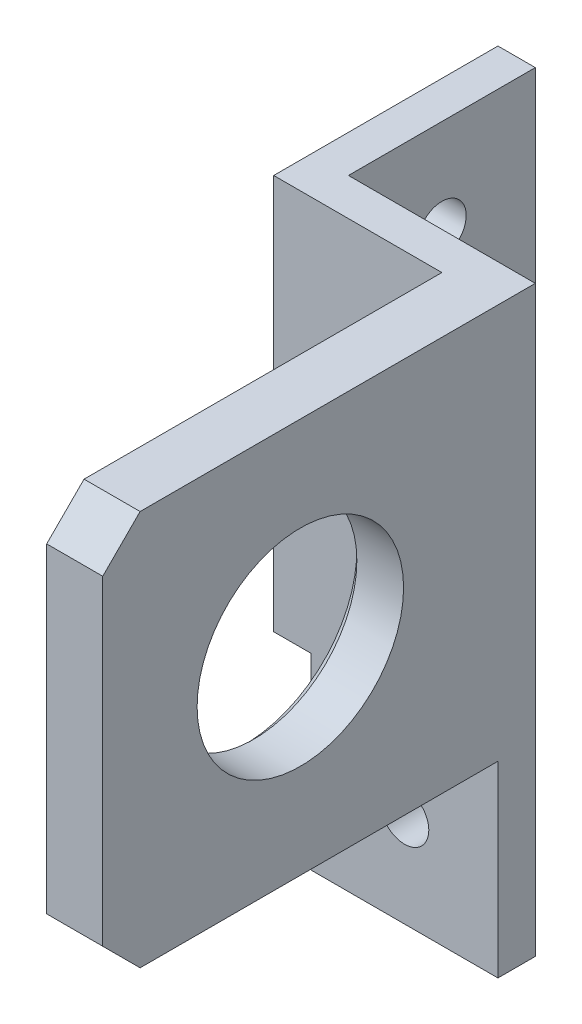
ISO-10303-21;
HEADER;
FILE_DESCRIPTION(('STEP AP214'),'2;1');
FILE_NAME('part.step','',(''),(''),'','','');
FILE_SCHEMA(('AUTOMOTIVE_DESIGN { 1 0 10303 214 1 1 1 1 }'));
ENDSEC;
DATA;
#1=APPLICATION_CONTEXT('core data for automotive mechanical design processes');
#2=APPLICATION_PROTOCOL_DEFINITION('international standard','automotive_design',2000,#1);
#3=PRODUCT_CONTEXT('',#1,'mechanical');
#4=PRODUCT('Part','Part','',(#3));
#5=PRODUCT_RELATED_PRODUCT_CATEGORY('part','',(#4));
#6=PRODUCT_DEFINITION_FORMATION('','',#4);
#7=PRODUCT_DEFINITION_CONTEXT('part definition',#1,'design');
#8=PRODUCT_DEFINITION('design','',#6,#7);
#9=PRODUCT_DEFINITION_SHAPE('','',#8);
#10=(LENGTH_UNIT() NAMED_UNIT(*) SI_UNIT(.MILLI.,.METRE.));
#11=(NAMED_UNIT(*) PLANE_ANGLE_UNIT() SI_UNIT($,.RADIAN.));
#12=(NAMED_UNIT(*) SI_UNIT($,.STERADIAN.) SOLID_ANGLE_UNIT());
#13=UNCERTAINTY_MEASURE_WITH_UNIT(LENGTH_MEASURE(1.E-05),#10,'distance_accuracy_value','');
#14=(GEOMETRIC_REPRESENTATION_CONTEXT(3) GLOBAL_UNCERTAINTY_ASSIGNED_CONTEXT((#13)) GLOBAL_UNIT_ASSIGNED_CONTEXT((#10,
#11,#12)) REPRESENTATION_CONTEXT('',''));
#15=CARTESIAN_POINT('',(0.,0.,0.));
#16=DIRECTION('',(0.,0.,1.));
#17=DIRECTION('',(1.,0.,0.));
#18=AXIS2_PLACEMENT_3D('',#15,#16,#17);
#19=CARTESIAN_POINT('',(-4.52428779759901,-82.2999999999999,4.));
#20=DIRECTION('',(0.,1.,0.));
#21=DIRECTION('',(-1.,0.,0.));
#22=AXIS2_PLACEMENT_3D('',#19,#20,#21);
#23=PLANE('',#22);
#24=DIRECTION('',(0.,0.,-1.));
#25=VECTOR('',#24,1.);
#26=CARTESIAN_POINT('',(-24.5242877975988,-82.2999999999999,0.));
#27=LINE('',#26,#25);
#28=CARTESIAN_POINT('',(-24.5242877975988,-82.2999999999999,4.00000000000001));
#29=VERTEX_POINT('',#28);
#30=CARTESIAN_POINT('',(-24.5242877975988,-82.2999999999999,0.));
#31=VERTEX_POINT('',#30);
#32=EDGE_CURVE('E236',#29,#31,#27,.T.);
#33=ORIENTED_EDGE('',*,*,#32,.F.);
#34=DIRECTION('',(1.,0.,0.));
#35=VECTOR('',#34,1.);
#36=CARTESIAN_POINT('',(-4.52428779759901,-82.2999999999999,4.));
#37=LINE('',#36,#35);
#38=CARTESIAN_POINT('',(-28.5242877975988,-82.2999999999999,4.00000000000001));
#39=VERTEX_POINT('',#38);
#40=EDGE_CURVE('E183',#39,#29,#37,.T.);
#41=ORIENTED_EDGE('',*,*,#40,.F.);
#42=DIRECTION('',(0.,0.,1.));
#43=VECTOR('',#42,1.);
#44=CARTESIAN_POINT('',(-28.5242877975988,-82.2999999999999,4.00000000000001));
#45=LINE('',#44,#43);
#46=CARTESIAN_POINT('',(-28.5242877975988,-82.2999999999999,-20.0000000000001));
#47=VERTEX_POINT('',#46);
#48=EDGE_CURVE('E165',#47,#39,#45,.T.);
#49=ORIENTED_EDGE('',*,*,#48,.F.);
#50=DIRECTION('',(1.,0.,0.));
#51=VECTOR('',#50,1.);
#52=CARTESIAN_POINT('',(-28.5242877975988,-82.2999999999999,-20.0000000000001));
#53=LINE('',#52,#51);
#54=CARTESIAN_POINT('',(-24.5242877975988,-82.2999999999999,-20.0000000000001));
#55=VERTEX_POINT('',#54);
#56=EDGE_CURVE('E168',#47,#55,#53,.T.);
#57=ORIENTED_EDGE('',*,*,#56,.T.);
#58=DIRECTION('',(0.,0.,1.));
#59=VECTOR('',#58,1.);
#60=CARTESIAN_POINT('',(-24.5242877975988,-82.2999999999999,4.00000000000001));
#61=LINE('',#60,#59);
#62=EDGE_CURVE('E161',#55,#31,#61,.T.);
#63=ORIENTED_EDGE('',*,*,#62,.T.);
#64=EDGE_LOOP('',(#33,#41,#49,#57,#63));
#65=FACE_BOUND('',#64,.T.);
#66=ADVANCED_FACE('F34',(#65),#23,.F.);
#67=DIRECTION('',(0.,0.,-1.));
#68=VECTOR('',#67,1.);
#69=CARTESIAN_POINT('',(-4.52428779759901,-82.2999999999999,4.));
#70=LINE('',#69,#68);
#71=CARTESIAN_POINT('',(-4.52428779759902,-82.2999999999999,42.3000000000002));
#72=VERTEX_POINT('',#71);
#73=CARTESIAN_POINT('',(-4.52428779759901,-82.2999999999999,4.));
#74=VERTEX_POINT('',#73);
#75=EDGE_CURVE('E187',#72,#74,#70,.T.);
#76=ORIENTED_EDGE('',*,*,#75,.F.);
#77=DIRECTION('',(-1.,0.,0.));
#78=VECTOR('',#77,1.);
#79=CARTESIAN_POINT('',(69.475712202401,-82.2999999999999,42.3000000000002));
#80=LINE('',#79,#78);
#81=CARTESIAN_POINT('',(-10.524287797599,-82.2999999999999,42.3000000000002));
#82=VERTEX_POINT('',#81);
#83=EDGE_CURVE('E140',#72,#82,#80,.T.);
#84=ORIENTED_EDGE('',*,*,#83,.T.);
#85=DIRECTION('',(0.,0.,-1.));
#86=VECTOR('',#85,1.);
#87=CARTESIAN_POINT('',(-10.524287797599,-82.2999999999999,89.0234127850291));
#88=LINE('',#87,#86);
#89=CARTESIAN_POINT('',(-10.524287797599,-82.2999999999999,4.));
#90=VERTEX_POINT('',#89);
#91=EDGE_CURVE('E149',#82,#90,#88,.T.);
#92=ORIENTED_EDGE('',*,*,#91,.T.);
#93=DIRECTION('',(-1.,0.,0.));
#94=VECTOR('',#93,1.);
#95=CARTESIAN_POINT('',(-4.52428779759901,-82.2999999999999,4.));
#96=LINE('',#95,#94);
#97=EDGE_CURVE('E239',#74,#90,#96,.T.);
#98=ORIENTED_EDGE('',*,*,#97,.F.);
#99=EDGE_LOOP('',(#76,#84,#92,#98));
#100=FACE_BOUND('',#99,.T.);
#101=ADVANCED_FACE('F259',(#100),#23,.F.);
#102=CARTESIAN_POINT('',(0.,0.,4.));
#103=DIRECTION('',(0.,0.,-1.));
#104=DIRECTION('',(-1.,0.,0.));
#105=AXIS2_PLACEMENT_3D('',#102,#103,#104);
#106=PLANE('',#105);
#107=CARTESIAN_POINT('',(-14.524287797599,-92.3915967434677,4.));
#108=DIRECTION('',(0.,0.,1.));
#109=DIRECTION('',(1.,0.,0.));
#110=AXIS2_PLACEMENT_3D('',#107,#108,#109);
#111=CIRCLE('',#110,2.6);
#112=CARTESIAN_POINT('',(-11.924287797599,-92.3915967434677,4.));
#113=VERTEX_POINT('',#112);
#114=EDGE_CURVE('E250',#113,#113,#111,.T.);
#115=ORIENTED_EDGE('',*,*,#114,.F.);
#116=EDGE_LOOP('',(#115));
#117=FACE_BOUND('',#116,.T.);
#118=DIRECTION('',(0.,-1.,0.));
#119=VECTOR('',#118,1.);
#120=CARTESIAN_POINT('',(-10.524287797599,-40.,4.));
#121=LINE('',#120,#119);
#122=CARTESIAN_POINT('',(-10.524287797599,-40.,4.));
#123=VERTEX_POINT('',#122);
#124=EDGE_CURVE('E146',#123,#90,#121,.T.);
#125=ORIENTED_EDGE('',*,*,#124,.F.);
#126=DIRECTION('',(-1.,0.,0.));
#127=VECTOR('',#126,1.);
#128=CARTESIAN_POINT('',(-4.52428779759901,-40.,4.));
#129=LINE('',#128,#127);
#130=CARTESIAN_POINT('',(-28.5242877975987,-40.,4.));
#131=VERTEX_POINT('',#130);
#132=EDGE_CURVE('E145',#123,#131,#129,.T.);
#133=ORIENTED_EDGE('',*,*,#132,.T.);
#134=DIRECTION('',(0.,1.,0.));
#135=VECTOR('',#134,1.);
#136=CARTESIAN_POINT('',(-28.5242877975987,-40.,4.));
#137=LINE('',#136,#135);
#138=EDGE_CURVE('E157',#39,#131,#137,.T.);
#139=ORIENTED_EDGE('',*,*,#138,.F.);
#140=ORIENTED_EDGE('',*,*,#40,.T.);
#141=DIRECTION('',(0.,1.,0.));
#142=VECTOR('',#141,1.);
#143=CARTESIAN_POINT('',(-24.5242877975989,-122.787674797839,4.00000000000001));
#144=LINE('',#143,#142);
#145=CARTESIAN_POINT('',(-24.5242877975988,-102.391596743468,4.00000000000001));
#146=VERTEX_POINT('',#145);
#147=EDGE_CURVE('E232',#146,#29,#144,.T.);
#148=ORIENTED_EDGE('',*,*,#147,.F.);
#149=DIRECTION('',(1.,0.,0.));
#150=VECTOR('',#149,1.);
#151=CARTESIAN_POINT('',(-4.52428779759903,-102.391596743468,4.));
#152=LINE('',#151,#150);
#153=CARTESIAN_POINT('',(-4.52428779759901,-102.391596743468,4.));
#154=VERTEX_POINT('',#153);
#155=EDGE_CURVE('E245',#146,#154,#152,.T.);
#156=ORIENTED_EDGE('',*,*,#155,.T.);
#157=DIRECTION('',(0.,1.,0.));
#158=VECTOR('',#157,1.);
#159=CARTESIAN_POINT('',(-4.52428779759904,-122.787674797839,4.));
#160=LINE('',#159,#158);
#161=EDGE_CURVE('E229',#154,#74,#160,.T.);
#162=ORIENTED_EDGE('',*,*,#161,.T.);
#163=ORIENTED_EDGE('',*,*,#97,.T.);
#164=EDGE_LOOP('',(#125,#133,#139,#140,#148,#156,#162,#163));
#165=FACE_BOUND('',#164,.T.);
#166=ADVANCED_FACE('F285',(#117,#165),#106,.F.);
#167=CARTESIAN_POINT('',(-4.52428779759901,-40.,4.));
#168=DIRECTION('',(-1.,0.,0.));
#169=DIRECTION('',(0.,-1.,0.));
#170=AXIS2_PLACEMENT_3D('',#167,#168,#169);
#171=PLANE('',#170);
#172=CARTESIAN_POINT('',(-4.52428779759902,-61.1499999999999,25.1499999999999));
#173=DIRECTION('',(1.,0.,0.));
#174=DIRECTION('',(0.,0.,-1.));
#175=AXIS2_PLACEMENT_3D('',#172,#173,#174);
#176=CIRCLE('',#175,11.05);
#177=CARTESIAN_POINT('',(-4.52428779759902,-61.1499999999999,14.0999999999999));
#178=VERTEX_POINT('',#177);
#179=EDGE_CURVE('E147',#178,#178,#176,.T.);
#180=ORIENTED_EDGE('',*,*,#179,.F.);
#181=EDGE_LOOP('',(#180));
#182=FACE_BOUND('',#181,.T.);
#183=DIRECTION('',(0.,0.,-1.));
#184=VECTOR('',#183,1.);
#185=CARTESIAN_POINT('',(-4.52428779759901,-40.,4.));
#186=LINE('',#185,#184);
#187=CARTESIAN_POINT('',(-4.52428779759902,-40.,42.3000000000001));
#188=VERTEX_POINT('',#187);
#189=CARTESIAN_POINT('',(-4.52428779759901,-40.,0.));
#190=VERTEX_POINT('',#189);
#191=EDGE_CURVE('E195',#188,#190,#186,.T.);
#192=ORIENTED_EDGE('',*,*,#191,.F.);
#193=DIRECTION('',(0.,-0.707106781186549,0.707106781186546));
#194=VECTOR('',#193,1.);
#195=CARTESIAN_POINT('',(-4.52428779759902,-20.8499999999999,23.1500000000001));
#196=LINE('',#195,#194);
#197=CARTESIAN_POINT('',(-4.524287797599,-43.9999999999998,46.3));
#198=VERTEX_POINT('',#197);
#199=EDGE_CURVE('E126',#188,#198,#196,.T.);
#200=ORIENTED_EDGE('',*,*,#199,.T.);
#201=DIRECTION('',(0.,1.,0.));
#202=VECTOR('',#201,1.);
#203=CARTESIAN_POINT('',(-4.52428779759901,-40.,46.3));
#204=LINE('',#203,#202);
#205=CARTESIAN_POINT('',(-4.52428779759901,-78.3000000000002,46.3));
#206=VERTEX_POINT('',#205);
#207=EDGE_CURVE('E172',#206,#198,#204,.T.);
#208=ORIENTED_EDGE('',*,*,#207,.F.);
#209=DIRECTION('',(0.,-0.707106781186546,-0.707106781186549));
#210=VECTOR('',#209,1.);
#211=CARTESIAN_POINT('',(-4.52428779759901,-80.3000000000002,44.3));
#212=LINE('',#211,#210);
#213=EDGE_CURVE('E49',#206,#72,#212,.T.);
#214=ORIENTED_EDGE('',*,*,#213,.T.);
#215=ORIENTED_EDGE('',*,*,#75,.T.);
#216=ORIENTED_EDGE('',*,*,#161,.F.);
#217=DIRECTION('',(0.,0.,-1.));
#218=VECTOR('',#217,1.);
#219=CARTESIAN_POINT('',(-4.52428779759902,-102.391596743468,0.));
#220=LINE('',#219,#218);
#221=CARTESIAN_POINT('',(-4.52428779759901,-102.391596743468,0.));
#222=VERTEX_POINT('',#221);
#223=EDGE_CURVE('E217',#154,#222,#220,.T.);
#224=ORIENTED_EDGE('',*,*,#223,.T.);
#225=DIRECTION('',(0.,1.,0.));
#226=VECTOR('',#225,1.);
#227=CARTESIAN_POINT('',(-4.52428779759901,-40.,0.));
#228=LINE('',#227,#226);
#229=EDGE_CURVE('E181',#222,#190,#228,.T.);
#230=ORIENTED_EDGE('',*,*,#229,.T.);
#231=EDGE_LOOP('',(#192,#200,#208,#214,#215,#216,#224,#230));
#232=FACE_BOUND('',#231,.T.);
#233=ADVANCED_FACE('F262',(#182,#232),#171,.F.);
#234=CARTESIAN_POINT('',(-4.52428779759901,-40.,4.));
#235=DIRECTION('',(0.,-1.,0.));
#236=DIRECTION('',(0.,0.,-1.));
#237=AXIS2_PLACEMENT_3D('',#234,#235,#236);
#238=PLANE('',#237);
#239=DIRECTION('',(0.,0.,-1.));
#240=VECTOR('',#239,1.);
#241=CARTESIAN_POINT('',(-10.524287797599,-40.,89.0234127850291));
#242=LINE('',#241,#240);
#243=CARTESIAN_POINT('',(-10.524287797599,-40.,42.3000000000001));
#244=VERTEX_POINT('',#243);
#245=EDGE_CURVE('E135',#244,#123,#242,.T.);
#246=ORIENTED_EDGE('',*,*,#245,.F.);
#247=DIRECTION('',(-1.,0.,0.));
#248=VECTOR('',#247,1.);
#249=CARTESIAN_POINT('',(69.475712202401,-40.,42.3000000000001));
#250=LINE('',#249,#248);
#251=EDGE_CURVE('E123',#188,#244,#250,.T.);
#252=ORIENTED_EDGE('',*,*,#251,.F.);
#253=ORIENTED_EDGE('',*,*,#191,.T.);
#254=DIRECTION('',(-1.,0.,0.));
#255=VECTOR('',#254,1.);
#256=CARTESIAN_POINT('',(-4.52428779759901,-40.,0.));
#257=LINE('',#256,#255);
#258=CARTESIAN_POINT('',(-24.5242877975987,-40.,0.));
#259=VERTEX_POINT('',#258);
#260=EDGE_CURVE('E190',#190,#259,#257,.T.);
#261=ORIENTED_EDGE('',*,*,#260,.T.);
#262=DIRECTION('',(0.,0.,-1.));
#263=VECTOR('',#262,1.);
#264=CARTESIAN_POINT('',(-24.5242877975987,-40.,4.));
#265=LINE('',#264,#263);
#266=CARTESIAN_POINT('',(-24.5242877975987,-40.,-20.0000000000001));
#267=VERTEX_POINT('',#266);
#268=EDGE_CURVE('E169',#259,#267,#265,.T.);
#269=ORIENTED_EDGE('',*,*,#268,.T.);
#270=DIRECTION('',(1.,0.,0.));
#271=VECTOR('',#270,1.);
#272=CARTESIAN_POINT('',(-28.5242877975987,-40.,-20.0000000000001));
#273=LINE('',#272,#271);
#274=CARTESIAN_POINT('',(-28.5242877975987,-40.,-20.0000000000001));
#275=VERTEX_POINT('',#274);
#276=EDGE_CURVE('E178',#275,#267,#273,.T.);
#277=ORIENTED_EDGE('',*,*,#276,.F.);
#278=DIRECTION('',(0.,0.,-1.));
#279=VECTOR('',#278,1.);
#280=CARTESIAN_POINT('',(-28.5242877975987,-40.,4.));
#281=LINE('',#280,#279);
#282=EDGE_CURVE('E160',#131,#275,#281,.T.);
#283=ORIENTED_EDGE('',*,*,#282,.F.);
#284=ORIENTED_EDGE('',*,*,#132,.F.);
#285=EDGE_LOOP('',(#246,#252,#253,#261,#269,#277,#283,#284));
#286=FACE_BOUND('',#285,.T.);
#287=ADVANCED_FACE('F143',(#286),#238,.F.);
#288=CARTESIAN_POINT('',(0.,0.,0.));
#289=DIRECTION('',(0.,0.,-1.));
#290=DIRECTION('',(-1.,0.,0.));
#291=AXIS2_PLACEMENT_3D('',#288,#289,#290);
#292=PLANE('',#291);
#293=CARTESIAN_POINT('',(-14.524287797599,-92.3915967434677,0.));
#294=DIRECTION('',(0.,0.,1.));
#295=DIRECTION('',(1.,0.,0.));
#296=AXIS2_PLACEMENT_3D('',#293,#294,#295);
#297=CIRCLE('',#296,2.6);
#298=CARTESIAN_POINT('',(-11.924287797599,-92.3915967434677,0.));
#299=VERTEX_POINT('',#298);
#300=EDGE_CURVE('E242',#299,#299,#297,.T.);
#301=ORIENTED_EDGE('',*,*,#300,.T.);
#302=EDGE_LOOP('',(#301));
#303=FACE_BOUND('',#302,.T.);
#304=ORIENTED_EDGE('',*,*,#229,.F.);
#305=DIRECTION('',(-1.,0.,0.));
#306=VECTOR('',#305,1.);
#307=CARTESIAN_POINT('',(-4.52428779759903,-102.391596743468,0.));
#308=LINE('',#307,#306);
#309=CARTESIAN_POINT('',(-24.5242877975988,-102.391596743468,0.));
#310=VERTEX_POINT('',#309);
#311=EDGE_CURVE('E225',#222,#310,#308,.T.);
#312=ORIENTED_EDGE('',*,*,#311,.T.);
#313=DIRECTION('',(0.,1.,0.));
#314=VECTOR('',#313,1.);
#315=CARTESIAN_POINT('',(-24.5242877975989,-122.787674797839,0.));
#316=LINE('',#315,#314);
#317=EDGE_CURVE('E234',#310,#31,#316,.T.);
#318=ORIENTED_EDGE('',*,*,#317,.T.);
#319=DIRECTION('',(0.,-1.,0.));
#320=VECTOR('',#319,1.);
#321=CARTESIAN_POINT('',(-24.5242877975987,-40.,0.));
#322=LINE('',#321,#320);
#323=EDGE_CURVE('E184',#259,#31,#322,.T.);
#324=ORIENTED_EDGE('',*,*,#323,.F.);
#325=ORIENTED_EDGE('',*,*,#260,.F.);
#326=EDGE_LOOP('',(#304,#312,#318,#324,#325));
#327=FACE_BOUND('',#326,.T.);
#328=ADVANCED_FACE('F267',(#303,#327),#292,.T.);
#329=CARTESIAN_POINT('',(-28.5242877975987,-40.,-20.0000000000001));
#330=DIRECTION('',(0.,0.,1.));
#331=DIRECTION('',(0.,-1.,0.));
#332=AXIS2_PLACEMENT_3D('',#329,#330,#331);
#333=PLANE('',#332);
#334=DIRECTION('',(0.,-1.,0.));
#335=VECTOR('',#334,1.);
#336=CARTESIAN_POINT('',(-24.5242877975987,-40.,-20.0000000000001));
#337=LINE('',#336,#335);
#338=EDGE_CURVE('E171',#267,#55,#337,.T.);
#339=ORIENTED_EDGE('',*,*,#338,.T.);
#340=ORIENTED_EDGE('',*,*,#56,.F.);
#341=DIRECTION('',(0.,-1.,0.));
#342=VECTOR('',#341,1.);
#343=CARTESIAN_POINT('',(-28.5242877975987,-40.,-20.0000000000001));
#344=LINE('',#343,#342);
#345=EDGE_CURVE('E163',#275,#47,#344,.T.);
#346=ORIENTED_EDGE('',*,*,#345,.F.);
#347=ORIENTED_EDGE('',*,*,#276,.T.);
#348=EDGE_LOOP('',(#339,#340,#346,#347));
#349=FACE_BOUND('',#348,.T.);
#350=ADVANCED_FACE('F278',(#349),#333,.F.);
#351=CARTESIAN_POINT('',(-28.5242877975987,0.,0.));
#352=DIRECTION('',(1.,0.,0.));
#353=DIRECTION('',(0.,1.,0.));
#354=AXIS2_PLACEMENT_3D('',#351,#352,#353);
#355=PLANE('',#354);
#356=CARTESIAN_POINT('',(-28.5242877975988,-50.,-10.0000000000001));
#357=DIRECTION('',(-1.,0.,0.));
#358=DIRECTION('',(0.,-1.,0.));
#359=AXIS2_PLACEMENT_3D('',#356,#357,#358);
#360=CIRCLE('',#359,2.6);
#361=CARTESIAN_POINT('',(-28.5242877975988,-52.6,-10.0000000000001));
#362=VERTEX_POINT('',#361);
#363=EDGE_CURVE('E220',#362,#362,#360,.T.);
#364=ORIENTED_EDGE('',*,*,#363,.F.);
#365=EDGE_LOOP('',(#364));
#366=FACE_BOUND('',#365,.T.);
#367=CARTESIAN_POINT('',(-28.5242877975988,-70.,-9.99999999999986));
#368=DIRECTION('',(-1.,0.,0.));
#369=DIRECTION('',(0.,-1.,0.));
#370=AXIS2_PLACEMENT_3D('',#367,#368,#369);
#371=CIRCLE('',#370,2.6);
#372=CARTESIAN_POINT('',(-28.5242877975988,-72.6,-9.99999999999986));
#373=VERTEX_POINT('',#372);
#374=EDGE_CURVE('E213',#373,#373,#371,.T.);
#375=ORIENTED_EDGE('',*,*,#374,.F.);
#376=EDGE_LOOP('',(#375));
#377=FACE_BOUND('',#376,.T.);
#378=ORIENTED_EDGE('',*,*,#138,.T.);
#379=ORIENTED_EDGE('',*,*,#282,.T.);
#380=ORIENTED_EDGE('',*,*,#345,.T.);
#381=ORIENTED_EDGE('',*,*,#48,.T.);
#382=EDGE_LOOP('',(#378,#379,#380,#381));
#383=FACE_BOUND('',#382,.T.);
#384=ADVANCED_FACE('F282',(#366,#377,#383),#355,.F.);
#385=CARTESIAN_POINT('',(-24.5242877975987,0.,0.));
#386=DIRECTION('',(1.,0.,0.));
#387=DIRECTION('',(0.,1.,0.));
#388=AXIS2_PLACEMENT_3D('',#385,#386,#387);
#389=PLANE('',#388);
#390=CARTESIAN_POINT('',(-24.5242877975988,-50.,-10.0000000000001));
#391=DIRECTION('',(-1.,0.,0.));
#392=DIRECTION('',(0.,-1.,0.));
#393=AXIS2_PLACEMENT_3D('',#390,#391,#392);
#394=CIRCLE('',#393,2.6);
#395=CARTESIAN_POINT('',(-24.5242877975988,-52.6,-10.0000000000001));
#396=VERTEX_POINT('',#395);
#397=EDGE_CURVE('E152',#396,#396,#394,.T.);
#398=ORIENTED_EDGE('',*,*,#397,.T.);
#399=EDGE_LOOP('',(#398));
#400=FACE_BOUND('',#399,.T.);
#401=CARTESIAN_POINT('',(-24.5242877975988,-70.,-9.99999999999986));
#402=DIRECTION('',(-1.,0.,0.));
#403=DIRECTION('',(0.,-1.,0.));
#404=AXIS2_PLACEMENT_3D('',#401,#402,#403);
#405=CIRCLE('',#404,2.6);
#406=CARTESIAN_POINT('',(-24.5242877975988,-72.6,-9.99999999999986));
#407=VERTEX_POINT('',#406);
#408=EDGE_CURVE('E216',#407,#407,#405,.T.);
#409=ORIENTED_EDGE('',*,*,#408,.T.);
#410=EDGE_LOOP('',(#409));
#411=FACE_BOUND('',#410,.T.);
#412=ORIENTED_EDGE('',*,*,#268,.F.);
#413=ORIENTED_EDGE('',*,*,#323,.T.);
#414=ORIENTED_EDGE('',*,*,#62,.F.);
#415=ORIENTED_EDGE('',*,*,#338,.F.);
#416=EDGE_LOOP('',(#412,#413,#414,#415));
#417=FACE_BOUND('',#416,.T.);
#418=ADVANCED_FACE('F274',(#400,#411,#417),#389,.T.);
#419=CARTESIAN_POINT('',(-10.524287797599,-40.,89.0234127850291));
#420=DIRECTION('',(1.,0.,0.));
#421=DIRECTION('',(0.,1.,0.));
#422=AXIS2_PLACEMENT_3D('',#419,#420,#421);
#423=PLANE('',#422);
#424=CARTESIAN_POINT('',(-10.524287797599,-61.1499999999999,25.1499999999999));
#425=DIRECTION('',(1.,0.,0.));
#426=DIRECTION('',(0.,1.,0.));
#427=AXIS2_PLACEMENT_3D('',#424,#425,#426);
#428=CIRCLE('',#427,12.05);
#429=CARTESIAN_POINT('',(-10.524287797599,-49.1,25.1499999999999));
#430=VERTEX_POINT('',#429);
#431=EDGE_CURVE('E197',#430,#430,#428,.T.);
#432=ORIENTED_EDGE('',*,*,#431,.T.);
#433=EDGE_LOOP('',(#432));
#434=FACE_BOUND('',#433,.T.);
#435=DIRECTION('',(0.,-1.,0.));
#436=VECTOR('',#435,1.);
#437=CARTESIAN_POINT('',(-10.524287797599,-40.,46.3));
#438=LINE('',#437,#436);
#439=CARTESIAN_POINT('',(-10.524287797599,-43.9999999999998,46.3));
#440=VERTEX_POINT('',#439);
#441=CARTESIAN_POINT('',(-10.524287797599,-78.3000000000002,46.3));
#442=VERTEX_POINT('',#441);
#443=EDGE_CURVE('E139',#440,#442,#438,.T.);
#444=ORIENTED_EDGE('',*,*,#443,.F.);
#445=DIRECTION('',(0.,-0.707106781186549,0.707106781186546));
#446=VECTOR('',#445,1.);
#447=CARTESIAN_POINT('',(-10.524287797599,-43.9999999999998,46.3));
#448=LINE('',#447,#446);
#449=EDGE_CURVE('E56',#244,#440,#448,.T.);
#450=ORIENTED_EDGE('',*,*,#449,.F.);
#451=ORIENTED_EDGE('',*,*,#245,.T.);
#452=ORIENTED_EDGE('',*,*,#124,.T.);
#453=ORIENTED_EDGE('',*,*,#91,.F.);
#454=DIRECTION('',(0.,-0.707106781186546,-0.707106781186549));
#455=VECTOR('',#454,1.);
#456=CARTESIAN_POINT('',(-10.524287797599,-82.2999999999999,42.3000000000002));
#457=LINE('',#456,#455);
#458=EDGE_CURVE('E203',#442,#82,#457,.T.);
#459=ORIENTED_EDGE('',*,*,#458,.F.);
#460=EDGE_LOOP('',(#444,#450,#451,#452,#453,#459));
#461=FACE_BOUND('',#460,.T.);
#462=ADVANCED_FACE('F133',(#434,#461),#423,.F.);
#463=CARTESIAN_POINT('',(-385.324287797599,-43.3139999999999,46.2999999999999));
#464=DIRECTION('',(0.,0.,1.));
#465=DIRECTION('',(0.,-1.,0.));
#466=AXIS2_PLACEMENT_3D('',#463,#464,#465);
#467=PLANE('',#466);
#468=DIRECTION('',(1.,0.,0.));
#469=VECTOR('',#468,1.);
#470=CARTESIAN_POINT('',(-385.324287797599,-43.9999999999998,46.2999999999999));
#471=LINE('',#470,#469);
#472=EDGE_CURVE('E12',#440,#198,#471,.T.);
#473=ORIENTED_EDGE('',*,*,#472,.F.);
#474=ORIENTED_EDGE('',*,*,#443,.T.);
#475=DIRECTION('',(-1.,0.,0.));
#476=VECTOR('',#475,1.);
#477=CARTESIAN_POINT('',(-385.324287797599,-78.3000000000002,46.2999999999999));
#478=LINE('',#477,#476);
#479=EDGE_CURVE('E42',#206,#442,#478,.T.);
#480=ORIENTED_EDGE('',*,*,#479,.F.);
#481=ORIENTED_EDGE('',*,*,#207,.T.);
#482=EDGE_LOOP('',(#473,#474,#480,#481));
#483=FACE_BOUND('',#482,.T.);
#484=ADVANCED_FACE('F210',(#483),#467,.T.);
#485=CARTESIAN_POINT('',(-11.524287797599,-61.1499999999999,25.1499999999999));
#486=DIRECTION('',(1.,0.,0.));
#487=DIRECTION('',(0.,0.,-1.));
#488=AXIS2_PLACEMENT_3D('',#485,#486,#487);
#489=CYLINDRICAL_SURFACE('',#488,11.05);
#490=CARTESIAN_POINT('',(-9.52428779759903,-61.1499999999999,25.1499999999999));
#491=DIRECTION('',(1.,0.,0.));
#492=DIRECTION('',(0.,0.,-1.));
#493=AXIS2_PLACEMENT_3D('',#490,#491,#492);
#494=CIRCLE('',#493,11.05);
#495=CARTESIAN_POINT('',(-9.52428779759903,-61.1499999999999,14.0999999999999));
#496=VERTEX_POINT('',#495);
#497=EDGE_CURVE('E200',#496,#496,#494,.F.);
#498=ORIENTED_EDGE('',*,*,#497,.T.);
#499=EDGE_LOOP('',(#498));
#500=FACE_BOUND('',#499,.T.);
#501=ORIENTED_EDGE('',*,*,#179,.T.);
#502=EDGE_LOOP('',(#501));
#503=FACE_BOUND('',#502,.T.);
#504=ADVANCED_FACE('F311',(#500,#503),#489,.F.);
#505=CARTESIAN_POINT('',(-24.5242877975988,-70.,-9.99999999999986));
#506=DIRECTION('',(-1.,0.,0.));
#507=DIRECTION('',(0.,-1.,0.));
#508=AXIS2_PLACEMENT_3D('',#505,#506,#507);
#509=CYLINDRICAL_SURFACE('',#508,2.6);
#510=ORIENTED_EDGE('',*,*,#408,.F.);
#511=EDGE_LOOP('',(#510));
#512=FACE_BOUND('',#511,.T.);
#513=ORIENTED_EDGE('',*,*,#374,.T.);
#514=EDGE_LOOP('',(#513));
#515=FACE_BOUND('',#514,.T.);
#516=ADVANCED_FACE('F313',(#512,#515),#509,.F.);
#517=CARTESIAN_POINT('',(-24.5242877975988,-50.,-10.0000000000001));
#518=DIRECTION('',(-1.,0.,0.));
#519=DIRECTION('',(0.,-1.,0.));
#520=AXIS2_PLACEMENT_3D('',#517,#518,#519);
#521=CYLINDRICAL_SURFACE('',#520,2.6);
#522=ORIENTED_EDGE('',*,*,#397,.F.);
#523=EDGE_LOOP('',(#522));
#524=FACE_BOUND('',#523,.T.);
#525=ORIENTED_EDGE('',*,*,#363,.T.);
#526=EDGE_LOOP('',(#525));
#527=FACE_BOUND('',#526,.T.);
#528=ADVANCED_FACE('F320',(#524,#527),#521,.F.);
#529=CARTESIAN_POINT('',(-10.524287797599,-61.1499999999999,25.1499999999999));
#530=DIRECTION('',(-1.,0.,0.));
#531=DIRECTION('',(0.,0.,1.));
#532=AXIS2_PLACEMENT_3D('',#529,#530,#531);
#533=CONICAL_SURFACE('',#532,12.05,0.785398163397442);
#534=ORIENTED_EDGE('',*,*,#497,.F.);
#535=EDGE_LOOP('',(#534));
#536=FACE_BOUND('',#535,.T.);
#537=ORIENTED_EDGE('',*,*,#431,.F.);
#538=EDGE_LOOP('',(#537));
#539=FACE_BOUND('',#538,.T.);
#540=ADVANCED_FACE('F36',(#536,#539),#533,.F.);
#541=CARTESIAN_POINT('',(-24.5242877975989,-122.787674797839,0.));
#542=DIRECTION('',(1.,0.,0.));
#543=DIRECTION('',(0.,1.,0.));
#544=AXIS2_PLACEMENT_3D('',#541,#542,#543);
#545=PLANE('',#544);
#546=ORIENTED_EDGE('',*,*,#317,.F.);
#547=DIRECTION('',(0.,0.,1.));
#548=VECTOR('',#547,1.);
#549=CARTESIAN_POINT('',(-24.5242877975988,-102.391596743468,0.));
#550=LINE('',#549,#548);
#551=EDGE_CURVE('E228',#310,#146,#550,.T.);
#552=ORIENTED_EDGE('',*,*,#551,.T.);
#553=ORIENTED_EDGE('',*,*,#147,.T.);
#554=ORIENTED_EDGE('',*,*,#32,.T.);
#555=EDGE_LOOP('',(#546,#552,#553,#554));
#556=FACE_BOUND('',#555,.T.);
#557=ADVANCED_FACE('F290',(#556),#545,.F.);
#558=CARTESIAN_POINT('',(-360.524287797599,-102.391596743468,-20.0000000000001));
#559=DIRECTION('',(0.,1.,0.));
#560=DIRECTION('',(-1.,0.,0.));
#561=AXIS2_PLACEMENT_3D('',#558,#559,#560);
#562=PLANE('',#561);
#563=ORIENTED_EDGE('',*,*,#155,.F.);
#564=ORIENTED_EDGE('',*,*,#551,.F.);
#565=ORIENTED_EDGE('',*,*,#311,.F.);
#566=ORIENTED_EDGE('',*,*,#223,.F.);
#567=EDGE_LOOP('',(#563,#564,#565,#566));
#568=FACE_BOUND('',#567,.T.);
#569=ADVANCED_FACE('F288',(#568),#562,.F.);
#570=CARTESIAN_POINT('',(-14.524287797599,-92.3915967434677,0.));
#571=DIRECTION('',(0.,0.,1.));
#572=DIRECTION('',(1.,0.,0.));
#573=AXIS2_PLACEMENT_3D('',#570,#571,#572);
#574=CYLINDRICAL_SURFACE('',#573,2.6);
#575=ORIENTED_EDGE('',*,*,#300,.F.);
#576=EDGE_LOOP('',(#575));
#577=FACE_BOUND('',#576,.T.);
#578=ORIENTED_EDGE('',*,*,#114,.T.);
#579=EDGE_LOOP('',(#578));
#580=FACE_BOUND('',#579,.T.);
#581=ADVANCED_FACE('F346',(#577,#580),#574,.F.);
#582=CARTESIAN_POINT('',(69.475712202401,-82.2999999999999,42.3000000000002));
#583=DIRECTION('',(0.,0.707106781186549,-0.707106781186546));
#584=DIRECTION('',(0.,0.707106781186546,0.707106781186549));
#585=AXIS2_PLACEMENT_3D('',#582,#583,#584);
#586=PLANE('',#585);
#587=ORIENTED_EDGE('',*,*,#479,.T.);
#588=ORIENTED_EDGE('',*,*,#458,.T.);
#589=ORIENTED_EDGE('',*,*,#83,.F.);
#590=ORIENTED_EDGE('',*,*,#213,.F.);
#591=EDGE_LOOP('',(#587,#588,#589,#590));
#592=FACE_BOUND('',#591,.T.);
#593=ADVANCED_FACE('F202',(#592),#586,.F.);
#594=CARTESIAN_POINT('',(69.475712202401,-43.9999999999998,46.3));
#595=DIRECTION('',(0.,-0.707106781186546,-0.707106781186549));
#596=DIRECTION('',(0.,0.707106781186549,-0.707106781186546));
#597=AXIS2_PLACEMENT_3D('',#594,#595,#596);
#598=PLANE('',#597);
#599=ORIENTED_EDGE('',*,*,#251,.T.);
#600=ORIENTED_EDGE('',*,*,#449,.T.);
#601=ORIENTED_EDGE('',*,*,#472,.T.);
#602=ORIENTED_EDGE('',*,*,#199,.F.);
#603=EDGE_LOOP('',(#599,#600,#601,#602));
#604=FACE_BOUND('',#603,.T.);
#605=ADVANCED_FACE('F124',(#604),#598,.F.);
#606=CLOSED_SHELL('',(#66,#101,#166,#233,#287,#328,#350,#384,#418,#462,#484,#504,#516,#528,#540,
#557,#569,#581,#593,#605));
#607=MANIFOLD_SOLID_BREP('B2',#606);
#608=ADVANCED_BREP_SHAPE_REPRESENTATION('',(#18,#607),#14);
#609=SHAPE_DEFINITION_REPRESENTATION(#9,#608);
ENDSEC;
END-ISO-10303-21;
